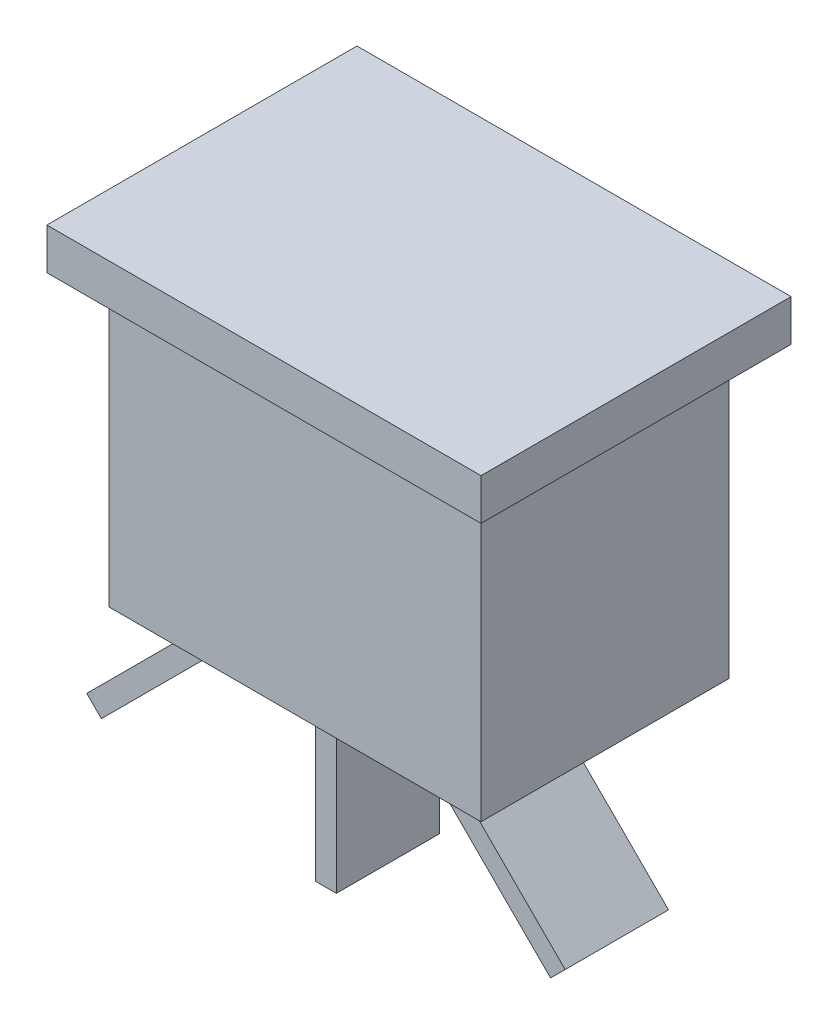
ISO-10303-21;
HEADER;
FILE_DESCRIPTION(('STEP AP214'),'2;1');
FILE_NAME('part.step','',(''),(''),'','','');
FILE_SCHEMA(('AUTOMOTIVE_DESIGN { 1 0 10303 214 1 1 1 1 }'));
ENDSEC;
DATA;
#1=APPLICATION_CONTEXT('core data for automotive mechanical design processes');
#2=APPLICATION_PROTOCOL_DEFINITION('international standard','automotive_design',2000,#1);
#3=PRODUCT_CONTEXT('',#1,'mechanical');
#4=PRODUCT('Part','Part','',(#3));
#5=PRODUCT_RELATED_PRODUCT_CATEGORY('part','',(#4));
#6=PRODUCT_DEFINITION_FORMATION('','',#4);
#7=PRODUCT_DEFINITION_CONTEXT('part definition',#1,'design');
#8=PRODUCT_DEFINITION('design','',#6,#7);
#9=PRODUCT_DEFINITION_SHAPE('','',#8);
#10=(LENGTH_UNIT() NAMED_UNIT(*) SI_UNIT(.MILLI.,.METRE.));
#11=(NAMED_UNIT(*) PLANE_ANGLE_UNIT() SI_UNIT($,.RADIAN.));
#12=(NAMED_UNIT(*) SI_UNIT($,.STERADIAN.) SOLID_ANGLE_UNIT());
#13=UNCERTAINTY_MEASURE_WITH_UNIT(LENGTH_MEASURE(1.E-05),#10,'distance_accuracy_value','');
#14=(GEOMETRIC_REPRESENTATION_CONTEXT(3) GLOBAL_UNCERTAINTY_ASSIGNED_CONTEXT((#13)) GLOBAL_UNIT_ASSIGNED_CONTEXT((#10,
#11,#12)) REPRESENTATION_CONTEXT('',''));
#15=CARTESIAN_POINT('',(0.,0.,0.));
#16=DIRECTION('',(0.,0.,1.));
#17=DIRECTION('',(1.,0.,0.));
#18=AXIS2_PLACEMENT_3D('',#15,#16,#17);
#19=CARTESIAN_POINT('',(0.,0.,0.));
#20=DIRECTION('',(0.,-1.,0.));
#21=DIRECTION('',(0.,0.,-1.));
#22=AXIS2_PLACEMENT_3D('',#19,#20,#21);
#23=PLANE('',#22);
#24=DIRECTION('',(0.,0.,1.));
#25=VECTOR('',#24,1.);
#26=CARTESIAN_POINT('',(0.,0.,4.));
#27=LINE('',#26,#25);
#28=CARTESIAN_POINT('',(0.,0.,-8.));
#29=VERTEX_POINT('',#28);
#30=CARTESIAN_POINT('',(0.,0.,4.));
#31=VERTEX_POINT('',#30);
#32=EDGE_CURVE('E299',#29,#31,#27,.T.);
#33=ORIENTED_EDGE('',*,*,#32,.F.);
#34=DIRECTION('',(-1.,0.,0.));
#35=VECTOR('',#34,1.);
#36=CARTESIAN_POINT('',(0.,0.,-8.));
#37=LINE('',#36,#35);
#38=CARTESIAN_POINT('',(18.,0.,-8.));
#39=VERTEX_POINT('',#38);
#40=EDGE_CURVE('E304',#39,#29,#37,.T.);
#41=ORIENTED_EDGE('',*,*,#40,.F.);
#42=DIRECTION('',(0.,0.,-1.));
#43=VECTOR('',#42,1.);
#44=CARTESIAN_POINT('',(18.,0.,4.));
#45=LINE('',#44,#43);
#46=CARTESIAN_POINT('',(18.,0.,4.));
#47=VERTEX_POINT('',#46);
#48=EDGE_CURVE('E318',#47,#39,#45,.T.);
#49=ORIENTED_EDGE('',*,*,#48,.F.);
#50=DIRECTION('',(1.,0.,0.));
#51=VECTOR('',#50,1.);
#52=CARTESIAN_POINT('',(0.,0.,4.));
#53=LINE('',#52,#51);
#54=EDGE_CURVE('E316',#31,#47,#53,.T.);
#55=ORIENTED_EDGE('',*,*,#54,.F.);
#56=EDGE_LOOP('',(#33,#41,#49,#55));
#57=FACE_BOUND('',#56,.T.);
#58=DIRECTION('',(0.,0.,1.));
#59=VECTOR('',#58,1.);
#60=CARTESIAN_POINT('',(9.5,0.,-2.5));
#61=LINE('',#60,#59);
#62=CARTESIAN_POINT('',(9.5,0.,-2.5));
#63=VERTEX_POINT('',#62);
#64=CARTESIAN_POINT('',(9.5,0.,2.5));
#65=VERTEX_POINT('',#64);
#66=EDGE_CURVE('E260',#63,#65,#61,.T.);
#67=ORIENTED_EDGE('',*,*,#66,.F.);
#68=DIRECTION('',(-1.,0.,0.));
#69=VECTOR('',#68,1.);
#70=CARTESIAN_POINT('',(9.5,0.,-2.5));
#71=LINE('',#70,#69);
#72=CARTESIAN_POINT('',(8.5,0.,-2.5));
#73=VERTEX_POINT('',#72);
#74=EDGE_CURVE('E252',#63,#73,#71,.T.);
#75=ORIENTED_EDGE('',*,*,#74,.T.);
#76=DIRECTION('',(0.,0.,1.));
#77=VECTOR('',#76,1.);
#78=CARTESIAN_POINT('',(8.5,0.,-2.5));
#79=LINE('',#78,#77);
#80=CARTESIAN_POINT('',(8.5,0.,2.5));
#81=VERTEX_POINT('',#80);
#82=EDGE_CURVE('E266',#73,#81,#79,.T.);
#83=ORIENTED_EDGE('',*,*,#82,.T.);
#84=DIRECTION('',(-1.,0.,0.));
#85=VECTOR('',#84,1.);
#86=CARTESIAN_POINT('',(9.5,0.,2.5));
#87=LINE('',#86,#85);
#88=EDGE_CURVE('E240',#65,#81,#87,.T.);
#89=ORIENTED_EDGE('',*,*,#88,.F.);
#90=EDGE_LOOP('',(#67,#75,#83,#89));
#91=FACE_BOUND('',#90,.T.);
#92=DIRECTION('',(0.,0.,1.));
#93=VECTOR('',#92,1.);
#94=CARTESIAN_POINT('',(14.914213562373,1.22844875777076E-13,-2.5));
#95=LINE('',#94,#93);
#96=CARTESIAN_POINT('',(14.9142135623731,0.,-2.5));
#97=VERTEX_POINT('',#96);
#98=CARTESIAN_POINT('',(14.914213562373,0.,2.5));
#99=VERTEX_POINT('',#98);
#100=EDGE_CURVE('E229',#97,#99,#95,.T.);
#101=ORIENTED_EDGE('',*,*,#100,.F.);
#102=DIRECTION('',(-1.,0.,0.));
#103=VECTOR('',#102,1.);
#104=CARTESIAN_POINT('',(14.914213562373,1.22844875777076E-13,-2.5));
#105=LINE('',#104,#103);
#106=CARTESIAN_POINT('',(13.5,0.,-2.5));
#107=VERTEX_POINT('',#106);
#108=EDGE_CURVE('E217',#97,#107,#105,.T.);
#109=ORIENTED_EDGE('',*,*,#108,.T.);
#110=DIRECTION('',(0.,0.,1.));
#111=VECTOR('',#110,1.);
#112=CARTESIAN_POINT('',(13.5,0.,-2.5));
#113=LINE('',#112,#111);
#114=CARTESIAN_POINT('',(13.5,0.,2.5));
#115=VERTEX_POINT('',#114);
#116=EDGE_CURVE('E228',#107,#115,#113,.T.);
#117=ORIENTED_EDGE('',*,*,#116,.T.);
#118=DIRECTION('',(-1.,0.,0.));
#119=VECTOR('',#118,1.);
#120=CARTESIAN_POINT('',(14.914213562373,1.22844875777076E-13,2.5));
#121=LINE('',#120,#119);
#122=EDGE_CURVE('E203',#99,#115,#121,.T.);
#123=ORIENTED_EDGE('',*,*,#122,.F.);
#124=EDGE_LOOP('',(#101,#109,#117,#123));
#125=FACE_BOUND('',#124,.T.);
#126=DIRECTION('',(0.,0.,1.));
#127=VECTOR('',#126,1.);
#128=CARTESIAN_POINT('',(4.5,0.,-2.5));
#129=LINE('',#128,#127);
#130=CARTESIAN_POINT('',(4.5,0.,-2.5));
#131=VERTEX_POINT('',#130);
#132=CARTESIAN_POINT('',(4.5,0.,2.5));
#133=VERTEX_POINT('',#132);
#134=EDGE_CURVE('E52',#131,#133,#129,.T.);
#135=ORIENTED_EDGE('',*,*,#134,.F.);
#136=DIRECTION('',(-1.,0.,0.));
#137=VECTOR('',#136,1.);
#138=CARTESIAN_POINT('',(3.0857864376269,0.,-2.5));
#139=LINE('',#138,#137);
#140=CARTESIAN_POINT('',(3.08578643762691,0.,-2.5));
#141=VERTEX_POINT('',#140);
#142=EDGE_CURVE('E47',#131,#141,#139,.T.);
#143=ORIENTED_EDGE('',*,*,#142,.T.);
#144=DIRECTION('',(0.,0.,1.));
#145=VECTOR('',#144,1.);
#146=CARTESIAN_POINT('',(3.0857864376269,0.,-2.5));
#147=LINE('',#146,#145);
#148=CARTESIAN_POINT('',(3.0857864376269,0.,2.5));
#149=VERTEX_POINT('',#148);
#150=EDGE_CURVE('E201',#141,#149,#147,.T.);
#151=ORIENTED_EDGE('',*,*,#150,.T.);
#152=DIRECTION('',(-1.,0.,0.));
#153=VECTOR('',#152,1.);
#154=CARTESIAN_POINT('',(3.0857864376269,0.,2.5));
#155=LINE('',#154,#153);
#156=EDGE_CURVE('E190',#133,#149,#155,.T.);
#157=ORIENTED_EDGE('',*,*,#156,.F.);
#158=EDGE_LOOP('',(#135,#143,#151,#157));
#159=FACE_BOUND('',#158,.T.);
#160=ADVANCED_FACE('F32',(#57,#91,#125,#159),#23,.T.);
#161=CARTESIAN_POINT('',(0.,14.,4.));
#162=DIRECTION('',(1.,0.,0.));
#163=DIRECTION('',(0.,0.,-1.));
#164=AXIS2_PLACEMENT_3D('',#161,#162,#163);
#165=PLANE('',#164);
#166=ORIENTED_EDGE('',*,*,#32,.T.);
#167=DIRECTION('',(0.,-1.,0.));
#168=VECTOR('',#167,1.);
#169=CARTESIAN_POINT('',(0.,14.,4.));
#170=LINE('',#169,#168);
#171=CARTESIAN_POINT('',(0.,14.,4.));
#172=VERTEX_POINT('',#171);
#173=EDGE_CURVE('E11',#172,#31,#170,.T.);
#174=ORIENTED_EDGE('',*,*,#173,.F.);
#175=DIRECTION('',(0.,0.,1.));
#176=VECTOR('',#175,1.);
#177=CARTESIAN_POINT('',(0.,14.,4.));
#178=LINE('',#177,#176);
#179=CARTESIAN_POINT('',(0.,14.,-8.));
#180=VERTEX_POINT('',#179);
#181=EDGE_CURVE('E300',#180,#172,#178,.T.);
#182=ORIENTED_EDGE('',*,*,#181,.F.);
#183=DIRECTION('',(0.,-1.,0.));
#184=VECTOR('',#183,1.);
#185=CARTESIAN_POINT('',(0.,14.,-8.));
#186=LINE('',#185,#184);
#187=EDGE_CURVE('E313',#180,#29,#186,.T.);
#188=ORIENTED_EDGE('',*,*,#187,.T.);
#189=EDGE_LOOP('',(#166,#174,#182,#188));
#190=FACE_BOUND('',#189,.T.);
#191=ADVANCED_FACE('F34',(#190),#165,.F.);
#192=CARTESIAN_POINT('',(0.,14.,4.));
#193=DIRECTION('',(0.,0.,-1.));
#194=DIRECTION('',(-1.,0.,0.));
#195=AXIS2_PLACEMENT_3D('',#192,#193,#194);
#196=PLANE('',#195);
#197=ORIENTED_EDGE('',*,*,#54,.T.);
#198=DIRECTION('',(0.,-1.,0.));
#199=VECTOR('',#198,1.);
#200=CARTESIAN_POINT('',(18.,14.,4.));
#201=LINE('',#200,#199);
#202=CARTESIAN_POINT('',(18.,14.,4.));
#203=VERTEX_POINT('',#202);
#204=EDGE_CURVE('E40',#203,#47,#201,.T.);
#205=ORIENTED_EDGE('',*,*,#204,.F.);
#206=DIRECTION('',(1.,0.,0.));
#207=VECTOR('',#206,1.);
#208=CARTESIAN_POINT('',(0.,14.,4.));
#209=LINE('',#208,#207);
#210=EDGE_CURVE('E303',#172,#203,#209,.T.);
#211=ORIENTED_EDGE('',*,*,#210,.F.);
#212=ORIENTED_EDGE('',*,*,#173,.T.);
#213=EDGE_LOOP('',(#197,#205,#211,#212));
#214=FACE_BOUND('',#213,.T.);
#215=ADVANCED_FACE('F343',(#214),#196,.F.);
#216=CARTESIAN_POINT('',(18.,14.,4.));
#217=DIRECTION('',(-1.,0.,0.));
#218=DIRECTION('',(0.,0.,1.));
#219=AXIS2_PLACEMENT_3D('',#216,#217,#218);
#220=PLANE('',#219);
#221=ORIENTED_EDGE('',*,*,#48,.T.);
#222=DIRECTION('',(0.,-1.,0.));
#223=VECTOR('',#222,1.);
#224=CARTESIAN_POINT('',(18.,14.,-8.));
#225=LINE('',#224,#223);
#226=CARTESIAN_POINT('',(18.,14.,-8.));
#227=VERTEX_POINT('',#226);
#228=EDGE_CURVE('E323',#227,#39,#225,.T.);
#229=ORIENTED_EDGE('',*,*,#228,.F.);
#230=DIRECTION('',(0.,0.,-1.));
#231=VECTOR('',#230,1.);
#232=CARTESIAN_POINT('',(18.,14.,4.));
#233=LINE('',#232,#231);
#234=EDGE_CURVE('E307',#203,#227,#233,.T.);
#235=ORIENTED_EDGE('',*,*,#234,.F.);
#236=ORIENTED_EDGE('',*,*,#204,.T.);
#237=EDGE_LOOP('',(#221,#229,#235,#236));
#238=FACE_BOUND('',#237,.T.);
#239=ADVANCED_FACE('F329',(#238),#220,.F.);
#240=CARTESIAN_POINT('',(0.,14.,-8.));
#241=DIRECTION('',(0.,0.,1.));
#242=DIRECTION('',(1.,0.,0.));
#243=AXIS2_PLACEMENT_3D('',#240,#241,#242);
#244=PLANE('',#243);
#245=ORIENTED_EDGE('',*,*,#40,.T.);
#246=ORIENTED_EDGE('',*,*,#187,.F.);
#247=DIRECTION('',(-1.,0.,0.));
#248=VECTOR('',#247,1.);
#249=CARTESIAN_POINT('',(0.,14.,-8.));
#250=LINE('',#249,#248);
#251=EDGE_CURVE('E310',#227,#180,#250,.T.);
#252=ORIENTED_EDGE('',*,*,#251,.F.);
#253=ORIENTED_EDGE('',*,*,#228,.T.);
#254=EDGE_LOOP('',(#245,#246,#252,#253));
#255=FACE_BOUND('',#254,.T.);
#256=ADVANCED_FACE('F337',(#255),#244,.F.);
#257=CARTESIAN_POINT('',(0.,14.,0.));
#258=DIRECTION('',(0.,1.,0.));
#259=DIRECTION('',(0.,0.,1.));
#260=AXIS2_PLACEMENT_3D('',#257,#258,#259);
#261=PLANE('',#260);
#262=DIRECTION('',(0.,0.,1.));
#263=VECTOR('',#262,1.);
#264=CARTESIAN_POINT('',(-1.5,14.,-9.50000000000001));
#265=LINE('',#264,#263);
#266=CARTESIAN_POINT('',(-1.5,14.,-9.50000000000001));
#267=VERTEX_POINT('',#266);
#268=CARTESIAN_POINT('',(-1.5,14.,5.50000000000001));
#269=VERTEX_POINT('',#268);
#270=EDGE_CURVE('E263',#267,#269,#265,.T.);
#271=ORIENTED_EDGE('',*,*,#270,.F.);
#272=DIRECTION('',(-1.,0.,0.));
#273=VECTOR('',#272,1.);
#274=CARTESIAN_POINT('',(-1.5,14.,-9.50000000000001));
#275=LINE('',#274,#273);
#276=CARTESIAN_POINT('',(19.5,14.,-9.50000000000001));
#277=VERTEX_POINT('',#276);
#278=EDGE_CURVE('E274',#277,#267,#275,.T.);
#279=ORIENTED_EDGE('',*,*,#278,.F.);
#280=DIRECTION('',(0.,0.,-1.));
#281=VECTOR('',#280,1.);
#282=CARTESIAN_POINT('',(19.5,14.,-9.50000000000001));
#283=LINE('',#282,#281);
#284=CARTESIAN_POINT('',(19.5,14.,5.5));
#285=VERTEX_POINT('',#284);
#286=EDGE_CURVE('E285',#285,#277,#283,.T.);
#287=ORIENTED_EDGE('',*,*,#286,.F.);
#288=DIRECTION('',(1.,0.,0.));
#289=VECTOR('',#288,1.);
#290=CARTESIAN_POINT('',(-1.5,14.,5.50000000000001));
#291=LINE('',#290,#289);
#292=EDGE_CURVE('E283',#269,#285,#291,.T.);
#293=ORIENTED_EDGE('',*,*,#292,.F.);
#294=EDGE_LOOP('',(#271,#279,#287,#293));
#295=FACE_BOUND('',#294,.T.);
#296=ORIENTED_EDGE('',*,*,#251,.T.);
#297=ORIENTED_EDGE('',*,*,#181,.T.);
#298=ORIENTED_EDGE('',*,*,#210,.T.);
#299=ORIENTED_EDGE('',*,*,#234,.T.);
#300=EDGE_LOOP('',(#296,#297,#298,#299));
#301=FACE_BOUND('',#300,.T.);
#302=ADVANCED_FACE('F342',(#295,#301),#261,.F.);
#303=CARTESIAN_POINT('',(-1.5,16.,-9.50000000000001));
#304=DIRECTION('',(1.,0.,0.));
#305=DIRECTION('',(0.,0.,-1.));
#306=AXIS2_PLACEMENT_3D('',#303,#304,#305);
#307=PLANE('',#306);
#308=ORIENTED_EDGE('',*,*,#270,.T.);
#309=DIRECTION('',(0.,-1.,0.));
#310=VECTOR('',#309,1.);
#311=CARTESIAN_POINT('',(-1.5,16.,5.50000000000001));
#312=LINE('',#311,#310);
#313=CARTESIAN_POINT('',(-1.5,16.,5.50000000000001));
#314=VERTEX_POINT('',#313);
#315=EDGE_CURVE('E296',#314,#269,#312,.T.);
#316=ORIENTED_EDGE('',*,*,#315,.F.);
#317=DIRECTION('',(0.,0.,1.));
#318=VECTOR('',#317,1.);
#319=CARTESIAN_POINT('',(-1.5,16.,-9.50000000000001));
#320=LINE('',#319,#318);
#321=CARTESIAN_POINT('',(-1.5,16.,-9.50000000000001));
#322=VERTEX_POINT('',#321);
#323=EDGE_CURVE('E270',#322,#314,#320,.T.);
#324=ORIENTED_EDGE('',*,*,#323,.F.);
#325=DIRECTION('',(0.,-1.,0.));
#326=VECTOR('',#325,1.);
#327=CARTESIAN_POINT('',(-1.5,16.,-9.50000000000001));
#328=LINE('',#327,#326);
#329=EDGE_CURVE('E280',#322,#267,#328,.T.);
#330=ORIENTED_EDGE('',*,*,#329,.T.);
#331=EDGE_LOOP('',(#308,#316,#324,#330));
#332=FACE_BOUND('',#331,.T.);
#333=ADVANCED_FACE('F356',(#332),#307,.F.);
#334=CARTESIAN_POINT('',(-1.5,16.,5.50000000000001));
#335=DIRECTION('',(0.,0.,-1.));
#336=DIRECTION('',(-1.,0.,0.));
#337=AXIS2_PLACEMENT_3D('',#334,#335,#336);
#338=PLANE('',#337);
#339=ORIENTED_EDGE('',*,*,#292,.T.);
#340=DIRECTION('',(0.,-1.,0.));
#341=VECTOR('',#340,1.);
#342=CARTESIAN_POINT('',(19.5,16.,5.5));
#343=LINE('',#342,#341);
#344=CARTESIAN_POINT('',(19.5,16.,5.5));
#345=VERTEX_POINT('',#344);
#346=EDGE_CURVE('E293',#345,#285,#343,.T.);
#347=ORIENTED_EDGE('',*,*,#346,.F.);
#348=DIRECTION('',(1.,0.,0.));
#349=VECTOR('',#348,1.);
#350=CARTESIAN_POINT('',(-1.5,16.,5.50000000000001));
#351=LINE('',#350,#349);
#352=EDGE_CURVE('E273',#314,#345,#351,.T.);
#353=ORIENTED_EDGE('',*,*,#352,.F.);
#354=ORIENTED_EDGE('',*,*,#315,.T.);
#355=EDGE_LOOP('',(#339,#347,#353,#354));
#356=FACE_BOUND('',#355,.T.);
#357=ADVANCED_FACE('F367',(#356),#338,.F.);
#358=CARTESIAN_POINT('',(19.5,16.,-9.50000000000001));
#359=DIRECTION('',(-1.,0.,0.));
#360=DIRECTION('',(0.,0.,1.));
#361=AXIS2_PLACEMENT_3D('',#358,#359,#360);
#362=PLANE('',#361);
#363=ORIENTED_EDGE('',*,*,#286,.T.);
#364=DIRECTION('',(0.,-1.,0.));
#365=VECTOR('',#364,1.);
#366=CARTESIAN_POINT('',(19.5,16.,-9.50000000000001));
#367=LINE('',#366,#365);
#368=CARTESIAN_POINT('',(19.5,16.,-9.50000000000001));
#369=VERTEX_POINT('',#368);
#370=EDGE_CURVE('E290',#369,#277,#367,.T.);
#371=ORIENTED_EDGE('',*,*,#370,.F.);
#372=DIRECTION('',(0.,0.,-1.));
#373=VECTOR('',#372,1.);
#374=CARTESIAN_POINT('',(19.5,16.,-9.50000000000001));
#375=LINE('',#374,#373);
#376=EDGE_CURVE('E276',#345,#369,#375,.T.);
#377=ORIENTED_EDGE('',*,*,#376,.F.);
#378=ORIENTED_EDGE('',*,*,#346,.T.);
#379=EDGE_LOOP('',(#363,#371,#377,#378));
#380=FACE_BOUND('',#379,.T.);
#381=ADVANCED_FACE('F377',(#380),#362,.F.);
#382=CARTESIAN_POINT('',(-1.5,16.,-9.50000000000001));
#383=DIRECTION('',(0.,0.,1.));
#384=DIRECTION('',(1.,0.,0.));
#385=AXIS2_PLACEMENT_3D('',#382,#383,#384);
#386=PLANE('',#385);
#387=ORIENTED_EDGE('',*,*,#278,.T.);
#388=ORIENTED_EDGE('',*,*,#329,.F.);
#389=DIRECTION('',(-1.,0.,0.));
#390=VECTOR('',#389,1.);
#391=CARTESIAN_POINT('',(-1.5,16.,-9.50000000000001));
#392=LINE('',#391,#390);
#393=EDGE_CURVE('E278',#369,#322,#392,.T.);
#394=ORIENTED_EDGE('',*,*,#393,.F.);
#395=ORIENTED_EDGE('',*,*,#370,.T.);
#396=EDGE_LOOP('',(#387,#388,#394,#395));
#397=FACE_BOUND('',#396,.T.);
#398=ADVANCED_FACE('F374',(#397),#386,.F.);
#399=CARTESIAN_POINT('',(0.,16.,0.));
#400=DIRECTION('',(0.,1.,0.));
#401=DIRECTION('',(0.,0.,1.));
#402=AXIS2_PLACEMENT_3D('',#399,#400,#401);
#403=PLANE('',#402);
#404=ORIENTED_EDGE('',*,*,#323,.T.);
#405=ORIENTED_EDGE('',*,*,#352,.T.);
#406=ORIENTED_EDGE('',*,*,#376,.T.);
#407=ORIENTED_EDGE('',*,*,#393,.T.);
#408=EDGE_LOOP('',(#404,#405,#406,#407));
#409=FACE_BOUND('',#408,.T.);
#410=ADVANCED_FACE('F372',(#409),#403,.T.);
#411=CARTESIAN_POINT('',(9.5,-8.,-2.5));
#412=DIRECTION('',(1.,0.,0.));
#413=DIRECTION('',(0.,1.,0.));
#414=AXIS2_PLACEMENT_3D('',#411,#412,#413);
#415=PLANE('',#414);
#416=ORIENTED_EDGE('',*,*,#66,.T.);
#417=DIRECTION('',(0.,1.,0.));
#418=VECTOR('',#417,1.);
#419=CARTESIAN_POINT('',(9.5,-8.,2.5));
#420=LINE('',#419,#418);
#421=CARTESIAN_POINT('',(9.5,-8.,2.5));
#422=VERTEX_POINT('',#421);
#423=EDGE_CURVE('E232',#422,#65,#420,.T.);
#424=ORIENTED_EDGE('',*,*,#423,.F.);
#425=DIRECTION('',(0.,0.,1.));
#426=VECTOR('',#425,1.);
#427=CARTESIAN_POINT('',(9.5,-8.,-2.5));
#428=LINE('',#427,#426);
#429=CARTESIAN_POINT('',(9.5,-8.,-2.5));
#430=VERTEX_POINT('',#429);
#431=EDGE_CURVE('E261',#430,#422,#428,.T.);
#432=ORIENTED_EDGE('',*,*,#431,.F.);
#433=DIRECTION('',(0.,1.,0.));
#434=VECTOR('',#433,1.);
#435=CARTESIAN_POINT('',(9.5,-8.,-2.5));
#436=LINE('',#435,#434);
#437=EDGE_CURVE('E249',#430,#63,#436,.T.);
#438=ORIENTED_EDGE('',*,*,#437,.T.);
#439=EDGE_LOOP('',(#416,#424,#432,#438));
#440=FACE_BOUND('',#439,.T.);
#441=ADVANCED_FACE('F396',(#440),#415,.T.);
#442=CARTESIAN_POINT('',(9.5,-8.,-2.5));
#443=DIRECTION('',(0.,-1.,0.));
#444=DIRECTION('',(0.,0.,-1.));
#445=AXIS2_PLACEMENT_3D('',#442,#443,#444);
#446=PLANE('',#445);
#447=ORIENTED_EDGE('',*,*,#431,.T.);
#448=DIRECTION('',(1.,0.,0.));
#449=VECTOR('',#448,1.);
#450=CARTESIAN_POINT('',(9.5,-8.,2.5));
#451=LINE('',#450,#449);
#452=CARTESIAN_POINT('',(8.5,-8.,2.5));
#453=VERTEX_POINT('',#452);
#454=EDGE_CURVE('E246',#453,#422,#451,.T.);
#455=ORIENTED_EDGE('',*,*,#454,.F.);
#456=DIRECTION('',(0.,0.,1.));
#457=VECTOR('',#456,1.);
#458=CARTESIAN_POINT('',(8.5,-8.,-2.5));
#459=LINE('',#458,#457);
#460=CARTESIAN_POINT('',(8.5,-8.,-2.5));
#461=VERTEX_POINT('',#460);
#462=EDGE_CURVE('E264',#461,#453,#459,.T.);
#463=ORIENTED_EDGE('',*,*,#462,.F.);
#464=DIRECTION('',(1.,0.,0.));
#465=VECTOR('',#464,1.);
#466=CARTESIAN_POINT('',(9.5,-8.,-2.5));
#467=LINE('',#466,#465);
#468=EDGE_CURVE('E257',#461,#430,#467,.T.);
#469=ORIENTED_EDGE('',*,*,#468,.T.);
#470=EDGE_LOOP('',(#447,#455,#463,#469));
#471=FACE_BOUND('',#470,.T.);
#472=ADVANCED_FACE('F400',(#471),#446,.T.);
#473=CARTESIAN_POINT('',(8.5,-8.,-2.5));
#474=DIRECTION('',(-1.,0.,0.));
#475=DIRECTION('',(0.,0.,1.));
#476=AXIS2_PLACEMENT_3D('',#473,#474,#475);
#477=PLANE('',#476);
#478=ORIENTED_EDGE('',*,*,#462,.T.);
#479=DIRECTION('',(0.,-1.,0.));
#480=VECTOR('',#479,1.);
#481=CARTESIAN_POINT('',(8.5,-8.,2.5));
#482=LINE('',#481,#480);
#483=EDGE_CURVE('E243',#81,#453,#482,.T.);
#484=ORIENTED_EDGE('',*,*,#483,.F.);
#485=ORIENTED_EDGE('',*,*,#82,.F.);
#486=DIRECTION('',(0.,-1.,0.));
#487=VECTOR('',#486,1.);
#488=CARTESIAN_POINT('',(8.5,-8.,-2.5));
#489=LINE('',#488,#487);
#490=EDGE_CURVE('E254',#73,#461,#489,.T.);
#491=ORIENTED_EDGE('',*,*,#490,.T.);
#492=EDGE_LOOP('',(#478,#484,#485,#491));
#493=FACE_BOUND('',#492,.T.);
#494=ADVANCED_FACE('F405',(#493),#477,.T.);
#495=CARTESIAN_POINT('',(0.,0.,-2.5));
#496=DIRECTION('',(0.,0.,1.));
#497=DIRECTION('',(1.,0.,0.));
#498=AXIS2_PLACEMENT_3D('',#495,#496,#497);
#499=PLANE('',#498);
#500=ORIENTED_EDGE('',*,*,#437,.F.);
#501=ORIENTED_EDGE('',*,*,#468,.F.);
#502=ORIENTED_EDGE('',*,*,#490,.F.);
#503=ORIENTED_EDGE('',*,*,#74,.F.);
#504=EDGE_LOOP('',(#500,#501,#502,#503));
#505=FACE_BOUND('',#504,.T.);
#506=ADVANCED_FACE('F410',(#505),#499,.F.);
#507=CARTESIAN_POINT('',(0.,0.,2.5));
#508=DIRECTION('',(0.,0.,1.));
#509=DIRECTION('',(1.,0.,0.));
#510=AXIS2_PLACEMENT_3D('',#507,#508,#509);
#511=PLANE('',#510);
#512=ORIENTED_EDGE('',*,*,#423,.T.);
#513=ORIENTED_EDGE('',*,*,#88,.T.);
#514=ORIENTED_EDGE('',*,*,#483,.T.);
#515=ORIENTED_EDGE('',*,*,#454,.T.);
#516=EDGE_LOOP('',(#512,#513,#514,#515));
#517=FACE_BOUND('',#516,.T.);
#518=ADVANCED_FACE('F415',(#517),#511,.T.);
#519=CARTESIAN_POINT('',(20.5710678118654,-5.65685424949223,-2.5));
#520=DIRECTION('',(0.707106781186544,0.707106781186551,0.));
#521=DIRECTION('',(-0.707106781186551,0.707106781186544,0.));
#522=AXIS2_PLACEMENT_3D('',#519,#520,#521);
#523=PLANE('',#522);
#524=ORIENTED_EDGE('',*,*,#100,.T.);
#525=DIRECTION('',(-0.707106781186551,0.707106781186544,0.));
#526=VECTOR('',#525,1.);
#527=CARTESIAN_POINT('',(20.5710678118654,-5.65685424949223,2.5));
#528=LINE('',#527,#526);
#529=CARTESIAN_POINT('',(20.5710678118654,-5.65685424949223,2.5));
#530=VERTEX_POINT('',#529);
#531=EDGE_CURVE('E214',#530,#99,#528,.T.);
#532=ORIENTED_EDGE('',*,*,#531,.F.);
#533=DIRECTION('',(0.,0.,1.));
#534=VECTOR('',#533,1.);
#535=CARTESIAN_POINT('',(20.5710678118654,-5.65685424949223,-2.5));
#536=LINE('',#535,#534);
#537=CARTESIAN_POINT('',(20.5710678118654,-5.65685424949223,-2.5));
#538=VERTEX_POINT('',#537);
#539=EDGE_CURVE('E233',#538,#530,#536,.T.);
#540=ORIENTED_EDGE('',*,*,#539,.F.);
#541=DIRECTION('',(-0.707106781186551,0.707106781186544,0.));
#542=VECTOR('',#541,1.);
#543=CARTESIAN_POINT('',(20.5710678118654,-5.65685424949223,-2.5));
#544=LINE('',#543,#542);
#545=EDGE_CURVE('E225',#538,#97,#544,.T.);
#546=ORIENTED_EDGE('',*,*,#545,.T.);
#547=EDGE_LOOP('',(#524,#532,#540,#546));
#548=FACE_BOUND('',#547,.T.);
#549=ADVANCED_FACE('F419',(#548),#523,.T.);
#550=CARTESIAN_POINT('',(19.8639610306788,-6.36396103067878,-2.5));
#551=DIRECTION('',(0.707106781186551,-0.707106781186545,0.));
#552=DIRECTION('',(0.707106781186545,0.707106781186551,0.));
#553=AXIS2_PLACEMENT_3D('',#550,#551,#552);
#554=PLANE('',#553);
#555=ORIENTED_EDGE('',*,*,#539,.T.);
#556=DIRECTION('',(0.707106781186545,0.707106781186551,0.));
#557=VECTOR('',#556,1.);
#558=CARTESIAN_POINT('',(19.8639610306788,-6.36396103067878,2.5));
#559=LINE('',#558,#557);
#560=CARTESIAN_POINT('',(19.8639610306788,-6.36396103067878,2.5));
#561=VERTEX_POINT('',#560);
#562=EDGE_CURVE('E211',#561,#530,#559,.T.);
#563=ORIENTED_EDGE('',*,*,#562,.F.);
#564=DIRECTION('',(0.,0.,1.));
#565=VECTOR('',#564,1.);
#566=CARTESIAN_POINT('',(19.8639610306788,-6.36396103067878,-2.5));
#567=LINE('',#566,#565);
#568=CARTESIAN_POINT('',(19.8639610306788,-6.36396103067878,-2.5));
#569=VERTEX_POINT('',#568);
#570=EDGE_CURVE('E235',#569,#561,#567,.T.);
#571=ORIENTED_EDGE('',*,*,#570,.F.);
#572=DIRECTION('',(0.707106781186545,0.707106781186551,0.));
#573=VECTOR('',#572,1.);
#574=CARTESIAN_POINT('',(19.8639610306788,-6.36396103067878,-2.5));
#575=LINE('',#574,#573);
#576=EDGE_CURVE('E222',#569,#538,#575,.T.);
#577=ORIENTED_EDGE('',*,*,#576,.T.);
#578=EDGE_LOOP('',(#555,#563,#571,#577));
#579=FACE_BOUND('',#578,.T.);
#580=ADVANCED_FACE('F425',(#579),#554,.T.);
#581=CARTESIAN_POINT('',(13.5,0.,-2.5));
#582=DIRECTION('',(-0.707106781186544,-0.707106781186551,0.));
#583=DIRECTION('',(0.707106781186551,-0.707106781186544,0.));
#584=AXIS2_PLACEMENT_3D('',#581,#582,#583);
#585=PLANE('',#584);
#586=ORIENTED_EDGE('',*,*,#570,.T.);
#587=DIRECTION('',(0.707106781186551,-0.707106781186544,0.));
#588=VECTOR('',#587,1.);
#589=CARTESIAN_POINT('',(13.5,0.,2.5));
#590=LINE('',#589,#588);
#591=EDGE_CURVE('E208',#115,#561,#590,.T.);
#592=ORIENTED_EDGE('',*,*,#591,.F.);
#593=ORIENTED_EDGE('',*,*,#116,.F.);
#594=DIRECTION('',(0.707106781186551,-0.707106781186544,0.));
#595=VECTOR('',#594,1.);
#596=CARTESIAN_POINT('',(13.5,0.,-2.5));
#597=LINE('',#596,#595);
#598=EDGE_CURVE('E219',#107,#569,#597,.T.);
#599=ORIENTED_EDGE('',*,*,#598,.T.);
#600=EDGE_LOOP('',(#586,#592,#593,#599));
#601=FACE_BOUND('',#600,.T.);
#602=ADVANCED_FACE('F421',(#601),#585,.T.);
#603=CARTESIAN_POINT('',(0.,0.,-2.5));
#604=DIRECTION('',(0.,0.,1.));
#605=DIRECTION('',(1.,0.,0.));
#606=AXIS2_PLACEMENT_3D('',#603,#604,#605);
#607=PLANE('',#606);
#608=ORIENTED_EDGE('',*,*,#108,.F.);
#609=ORIENTED_EDGE('',*,*,#545,.F.);
#610=ORIENTED_EDGE('',*,*,#576,.F.);
#611=ORIENTED_EDGE('',*,*,#598,.F.);
#612=EDGE_LOOP('',(#608,#609,#610,#611));
#613=FACE_BOUND('',#612,.T.);
#614=ADVANCED_FACE('F424',(#613),#607,.F.);
#615=CARTESIAN_POINT('',(0.,0.,2.5));
#616=DIRECTION('',(0.,0.,1.));
#617=DIRECTION('',(1.,0.,0.));
#618=AXIS2_PLACEMENT_3D('',#615,#616,#617);
#619=PLANE('',#618);
#620=ORIENTED_EDGE('',*,*,#122,.T.);
#621=ORIENTED_EDGE('',*,*,#591,.T.);
#622=ORIENTED_EDGE('',*,*,#562,.T.);
#623=ORIENTED_EDGE('',*,*,#531,.T.);
#624=EDGE_LOOP('',(#620,#621,#622,#623));
#625=FACE_BOUND('',#624,.T.);
#626=ADVANCED_FACE('F435',(#625),#619,.T.);
#627=CARTESIAN_POINT('',(-2.57106781186547,-5.6568542494924,-2.5));
#628=DIRECTION('',(-0.707106781186549,0.707106781186546,0.));
#629=DIRECTION('',(-0.707106781186546,-0.707106781186549,0.));
#630=AXIS2_PLACEMENT_3D('',#627,#628,#629);
#631=PLANE('',#630);
#632=DIRECTION('',(0.,0.,1.));
#633=VECTOR('',#632,1.);
#634=CARTESIAN_POINT('',(-2.57106781186547,-5.6568542494924,-2.5));
#635=LINE('',#634,#633);
#636=CARTESIAN_POINT('',(-2.57106781186547,-5.6568542494924,-2.5));
#637=VERTEX_POINT('',#636);
#638=CARTESIAN_POINT('',(-2.57106781186547,-5.6568542494924,2.5));
#639=VERTEX_POINT('',#638);
#640=EDGE_CURVE('E168',#637,#639,#635,.T.);
#641=ORIENTED_EDGE('',*,*,#640,.T.);
#642=DIRECTION('',(-0.707106781186546,-0.707106781186549,0.));
#643=VECTOR('',#642,1.);
#644=CARTESIAN_POINT('',(-2.57106781186547,-5.6568542494924,2.5));
#645=LINE('',#644,#643);
#646=EDGE_CURVE('E172',#149,#639,#645,.T.);
#647=ORIENTED_EDGE('',*,*,#646,.F.);
#648=ORIENTED_EDGE('',*,*,#150,.F.);
#649=DIRECTION('',(-0.707106781186546,-0.707106781186549,0.));
#650=VECTOR('',#649,1.);
#651=CARTESIAN_POINT('',(-2.57106781186547,-5.6568542494924,-2.5));
#652=LINE('',#651,#650);
#653=EDGE_CURVE('E174',#141,#637,#652,.T.);
#654=ORIENTED_EDGE('',*,*,#653,.T.);
#655=EDGE_LOOP('',(#641,#647,#648,#654));
#656=FACE_BOUND('',#655,.T.);
#657=ADVANCED_FACE('F170',(#656),#631,.T.);
#658=CARTESIAN_POINT('',(4.5,0.,-2.5));
#659=DIRECTION('',(0.707106781186549,-0.707106781186546,0.));
#660=DIRECTION('',(0.707106781186546,0.707106781186549,0.));
#661=AXIS2_PLACEMENT_3D('',#658,#659,#660);
#662=PLANE('',#661);
#663=ORIENTED_EDGE('',*,*,#134,.T.);
#664=DIRECTION('',(0.707106781186546,0.707106781186549,0.));
#665=VECTOR('',#664,1.);
#666=CARTESIAN_POINT('',(4.5,0.,2.5));
#667=LINE('',#666,#665);
#668=CARTESIAN_POINT('',(-1.86396103067892,-6.36396103067895,2.5));
#669=VERTEX_POINT('',#668);
#670=EDGE_CURVE('E186',#669,#133,#667,.T.);
#671=ORIENTED_EDGE('',*,*,#670,.F.);
#672=DIRECTION('',(0.,0.,1.));
#673=VECTOR('',#672,1.);
#674=CARTESIAN_POINT('',(-1.86396103067892,-6.36396103067895,-2.5));
#675=LINE('',#674,#673);
#676=CARTESIAN_POINT('',(-1.86396103067892,-6.36396103067895,-2.5));
#677=VERTEX_POINT('',#676);
#678=EDGE_CURVE('E178',#677,#669,#675,.T.);
#679=ORIENTED_EDGE('',*,*,#678,.F.);
#680=DIRECTION('',(0.707106781186546,0.707106781186549,0.));
#681=VECTOR('',#680,1.);
#682=CARTESIAN_POINT('',(4.5,0.,-2.5));
#683=LINE('',#682,#681);
#684=EDGE_CURVE('E198',#677,#131,#683,.T.);
#685=ORIENTED_EDGE('',*,*,#684,.T.);
#686=EDGE_LOOP('',(#663,#671,#679,#685));
#687=FACE_BOUND('',#686,.T.);
#688=ADVANCED_FACE('F442',(#687),#662,.T.);
#689=CARTESIAN_POINT('',(-1.86396103067892,-6.36396103067895,-2.5));
#690=DIRECTION('',(-0.707106781186547,-0.707106781186548,0.));
#691=DIRECTION('',(0.707106781186548,-0.707106781186547,0.));
#692=AXIS2_PLACEMENT_3D('',#689,#690,#691);
#693=PLANE('',#692);
#694=ORIENTED_EDGE('',*,*,#678,.T.);
#695=DIRECTION('',(0.707106781186548,-0.707106781186547,0.));
#696=VECTOR('',#695,1.);
#697=CARTESIAN_POINT('',(-1.86396103067892,-6.36396103067895,2.5));
#698=LINE('',#697,#696);
#699=EDGE_CURVE('E181',#639,#669,#698,.T.);
#700=ORIENTED_EDGE('',*,*,#699,.F.);
#701=ORIENTED_EDGE('',*,*,#640,.F.);
#702=DIRECTION('',(0.707106781186548,-0.707106781186547,0.));
#703=VECTOR('',#702,1.);
#704=CARTESIAN_POINT('',(-1.86396103067892,-6.36396103067895,-2.5));
#705=LINE('',#704,#703);
#706=EDGE_CURVE('E196',#637,#677,#705,.T.);
#707=ORIENTED_EDGE('',*,*,#706,.T.);
#708=EDGE_LOOP('',(#694,#700,#701,#707));
#709=FACE_BOUND('',#708,.T.);
#710=ADVANCED_FACE('F182',(#709),#693,.T.);
#711=CARTESIAN_POINT('',(0.,0.,-2.5));
#712=DIRECTION('',(0.,0.,1.));
#713=DIRECTION('',(1.,0.,0.));
#714=AXIS2_PLACEMENT_3D('',#711,#712,#713);
#715=PLANE('',#714);
#716=ORIENTED_EDGE('',*,*,#653,.F.);
#717=ORIENTED_EDGE('',*,*,#142,.F.);
#718=ORIENTED_EDGE('',*,*,#684,.F.);
#719=ORIENTED_EDGE('',*,*,#706,.F.);
#720=EDGE_LOOP('',(#716,#717,#718,#719));
#721=FACE_BOUND('',#720,.T.);
#722=ADVANCED_FACE('F445',(#721),#715,.F.);
#723=CARTESIAN_POINT('',(0.,0.,2.5));
#724=DIRECTION('',(0.,0.,1.));
#725=DIRECTION('',(1.,0.,0.));
#726=AXIS2_PLACEMENT_3D('',#723,#724,#725);
#727=PLANE('',#726);
#728=ORIENTED_EDGE('',*,*,#646,.T.);
#729=ORIENTED_EDGE('',*,*,#699,.T.);
#730=ORIENTED_EDGE('',*,*,#670,.T.);
#731=ORIENTED_EDGE('',*,*,#156,.T.);
#732=EDGE_LOOP('',(#728,#729,#730,#731));
#733=FACE_BOUND('',#732,.T.);
#734=ADVANCED_FACE('F189',(#733),#727,.T.);
#735=CLOSED_SHELL('',(#160,#191,#215,#239,#256,#302,#333,#357,#381,#398,#410,#441,#472,#494,
#506,#518,#549,#580,#602,#614,#626,#657,#688,#710,#722,#734));
#736=MANIFOLD_SOLID_BREP('B2',#735);
#737=ADVANCED_BREP_SHAPE_REPRESENTATION('',(#18,#736),#14);
#738=SHAPE_DEFINITION_REPRESENTATION(#9,#737);
ENDSEC;
END-ISO-10303-21;
